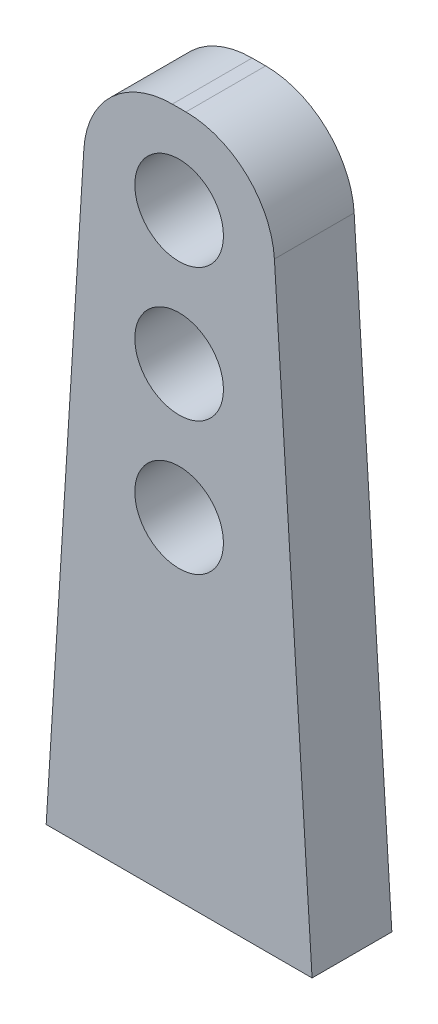
ISO-10303-21;
HEADER;
FILE_DESCRIPTION(('STEP AP214'),'2;1');
FILE_NAME('part.step','',(''),(''),'','','');
FILE_SCHEMA(('AUTOMOTIVE_DESIGN { 1 0 10303 214 1 1 1 1 }'));
ENDSEC;
DATA;
#1=APPLICATION_CONTEXT('core data for automotive mechanical design processes');
#2=APPLICATION_PROTOCOL_DEFINITION('international standard','automotive_design',2000,#1);
#3=PRODUCT_CONTEXT('',#1,'mechanical');
#4=PRODUCT('Part','Part','',(#3));
#5=PRODUCT_RELATED_PRODUCT_CATEGORY('part','',(#4));
#6=PRODUCT_DEFINITION_FORMATION('','',#4);
#7=PRODUCT_DEFINITION_CONTEXT('part definition',#1,'design');
#8=PRODUCT_DEFINITION('design','',#6,#7);
#9=PRODUCT_DEFINITION_SHAPE('','',#8);
#10=(LENGTH_UNIT() NAMED_UNIT(*) SI_UNIT(.MILLI.,.METRE.));
#11=(NAMED_UNIT(*) PLANE_ANGLE_UNIT() SI_UNIT($,.RADIAN.));
#12=(NAMED_UNIT(*) SI_UNIT($,.STERADIAN.) SOLID_ANGLE_UNIT());
#13=UNCERTAINTY_MEASURE_WITH_UNIT(LENGTH_MEASURE(1.E-05),#10,'distance_accuracy_value','');
#14=(GEOMETRIC_REPRESENTATION_CONTEXT(3) GLOBAL_UNCERTAINTY_ASSIGNED_CONTEXT((#13)) GLOBAL_UNIT_ASSIGNED_CONTEXT((#10,
#11,#12)) REPRESENTATION_CONTEXT('',''));
#15=CARTESIAN_POINT('',(0.,0.,0.));
#16=DIRECTION('',(0.,0.,1.));
#17=DIRECTION('',(1.,0.,0.));
#18=AXIS2_PLACEMENT_3D('',#15,#16,#17);
#19=CARTESIAN_POINT('',(1.5698711254477,6.70179743035683,0.899922));
#20=DIRECTION('',(0.,0.,1.));
#21=DIRECTION('',(1.,0.,0.));
#22=AXIS2_PLACEMENT_3D('',#19,#20,#21);
#23=PLANE('',#22);
#24=CARTESIAN_POINT('',(1.4929012576455,5.20179743035684,0.899922));
#25=DIRECTION('',(0.,0.,1.));
#26=DIRECTION('',(1.,0.,0.));
#27=AXIS2_PLACEMENT_3D('',#24,#25,#26);
#28=CIRCLE('',#27,0.499999999999996);
#29=CARTESIAN_POINT('',(1.9929012576455,5.20179743035684,0.899922));
#30=VERTEX_POINT('',#29);
#31=EDGE_CURVE('E253',#30,#30,#28,.T.);
#32=ORIENTED_EDGE('',*,*,#31,.F.);
#33=EDGE_LOOP('',(#32));
#34=FACE_BOUND('',#33,.T.);
#35=DIRECTION('',(1.,0.,0.));
#36=VECTOR('',#35,1.);
#37=CARTESIAN_POINT('',(-0.00709874235449632,-0.0482025696431649,0.899922));
#38=LINE('',#37,#36);
#39=CARTESIAN_POINT('',(-0.00709874235449632,-0.0482025696431649,0.899922));
#40=VERTEX_POINT('',#39);
#41=CARTESIAN_POINT('',(2.9929012576455,-0.0482025696431649,0.899922));
#42=VERTEX_POINT('',#41);
#43=EDGE_CURVE('E198',#40,#42,#38,.T.);
#44=ORIENTED_EDGE('',*,*,#43,.T.);
#45=DIRECTION('',(-0.0622621060775064,0.998059832949304,0.));
#46=VECTOR('',#45,1.);
#47=CARTESIAN_POINT('',(2.9929012576455,-0.0482025696431649,0.899922));
#48=LINE('',#47,#46);
#49=CARTESIAN_POINT('',(2.567930958397,6.76405953643435,0.899922));
#50=VERTEX_POINT('',#49);
#51=EDGE_CURVE('E156',#42,#50,#48,.T.);
#52=ORIENTED_EDGE('',*,*,#51,.T.);
#53=CARTESIAN_POINT('',(1.5698711254477,6.70179743035683,0.899922));
#54=DIRECTION('',(0.,0.,1.));
#55=DIRECTION('',(1.,0.,0.));
#56=AXIS2_PLACEMENT_3D('',#53,#54,#55);
#57=CIRCLE('',#56,1.);
#58=CARTESIAN_POINT('',(1.5698711254477,7.70179743035683,0.899922));
#59=VERTEX_POINT('',#58);
#60=EDGE_CURVE('E169',#50,#59,#57,.T.);
#61=ORIENTED_EDGE('',*,*,#60,.T.);
#62=DIRECTION('',(-1.,0.,0.));
#63=VECTOR('',#62,1.);
#64=CARTESIAN_POINT('',(1.5698711254477,7.70179743035683,0.899922));
#65=LINE('',#64,#63);
#66=CARTESIAN_POINT('',(1.41624750950107,7.70179743035683,0.899922));
#67=VERTEX_POINT('',#66);
#68=EDGE_CURVE('E163',#59,#67,#65,.T.);
#69=ORIENTED_EDGE('',*,*,#68,.T.);
#70=CARTESIAN_POINT('',(1.41624750950107,6.70179743035683,0.899922));
#71=DIRECTION('',(0.,0.,1.));
#72=DIRECTION('',(1.,0.,0.));
#73=AXIS2_PLACEMENT_3D('',#70,#71,#72);
#74=CIRCLE('',#73,1.);
#75=CARTESIAN_POINT('',(0.418190555641917,6.76410567101073,0.899922));
#76=VERTEX_POINT('',#75);
#77=EDGE_CURVE('E167',#67,#76,#74,.T.);
#78=ORIENTED_EDGE('',*,*,#77,.T.);
#79=DIRECTION('',(-0.0623082406538983,-0.998056953859155,0.));
#80=VECTOR('',#79,1.);
#81=CARTESIAN_POINT('',(0.418190555641916,6.76410567101073,0.899922));
#82=LINE('',#81,#80);
#83=EDGE_CURVE('E119',#76,#40,#82,.T.);
#84=ORIENTED_EDGE('',*,*,#83,.T.);
#85=EDGE_LOOP('',(#44,#52,#61,#69,#78,#84));
#86=FACE_BOUND('',#85,.T.);
#87=CARTESIAN_POINT('',(1.4929012576455,3.70179743035684,0.899922));
#88=DIRECTION('',(0.,0.,1.));
#89=DIRECTION('',(1.,0.,0.));
#90=AXIS2_PLACEMENT_3D('',#87,#88,#89);
#91=CIRCLE('',#90,0.499999999999995);
#92=CARTESIAN_POINT('',(1.9929012576455,3.70179743035684,0.899922));
#93=VERTEX_POINT('',#92);
#94=EDGE_CURVE('E191',#93,#93,#91,.T.);
#95=ORIENTED_EDGE('',*,*,#94,.F.);
#96=EDGE_LOOP('',(#95));
#97=FACE_BOUND('',#96,.T.);
#98=CARTESIAN_POINT('',(1.4929012576455,6.70179743035683,0.899922));
#99=DIRECTION('',(0.,0.,1.));
#100=DIRECTION('',(1.,0.,0.));
#101=AXIS2_PLACEMENT_3D('',#98,#99,#100);
#102=CIRCLE('',#101,0.499999999999996);
#103=CARTESIAN_POINT('',(1.9929012576455,6.70179743035683,0.899922));
#104=VERTEX_POINT('',#103);
#105=EDGE_CURVE('E244',#104,#104,#102,.T.);
#106=ORIENTED_EDGE('',*,*,#105,.F.);
#107=EDGE_LOOP('',(#106));
#108=FACE_BOUND('',#107,.T.);
#109=ADVANCED_FACE('F102',(#34,#86,#97,#108),#23,.T.);
#110=CARTESIAN_POINT('',(1.5698711254477,6.70179743035683,0.));
#111=DIRECTION('',(0.,0.,1.));
#112=DIRECTION('',(1.,0.,0.));
#113=AXIS2_PLACEMENT_3D('',#110,#111,#112);
#114=PLANE('',#113);
#115=DIRECTION('',(1.,0.,0.));
#116=VECTOR('',#115,1.);
#117=CARTESIAN_POINT('',(-0.00709874235449632,-0.0482025696431649,0.));
#118=LINE('',#117,#116);
#119=CARTESIAN_POINT('',(-0.00709874235449632,-0.0482025696431649,0.));
#120=VERTEX_POINT('',#119);
#121=CARTESIAN_POINT('',(2.9929012576455,-0.0482025696431649,0.));
#122=VERTEX_POINT('',#121);
#123=EDGE_CURVE('E187',#120,#122,#118,.T.);
#124=ORIENTED_EDGE('',*,*,#123,.F.);
#125=DIRECTION('',(-0.0623082406538983,-0.998056953859155,0.));
#126=VECTOR('',#125,1.);
#127=CARTESIAN_POINT('',(0.418190555641916,6.76410567101073,0.));
#128=LINE('',#127,#126);
#129=CARTESIAN_POINT('',(0.418190555641917,6.76410567101073,0.));
#130=VERTEX_POINT('',#129);
#131=EDGE_CURVE('E148',#130,#120,#128,.T.);
#132=ORIENTED_EDGE('',*,*,#131,.F.);
#133=CARTESIAN_POINT('',(1.41624750950107,6.70179743035683,0.));
#134=DIRECTION('',(0.,0.,1.));
#135=DIRECTION('',(1.,0.,0.));
#136=AXIS2_PLACEMENT_3D('',#133,#134,#135);
#137=CIRCLE('',#136,1.);
#138=CARTESIAN_POINT('',(1.41624750950107,7.70179743035683,0.));
#139=VERTEX_POINT('',#138);
#140=EDGE_CURVE('E142',#139,#130,#137,.T.);
#141=ORIENTED_EDGE('',*,*,#140,.F.);
#142=DIRECTION('',(-1.,0.,0.));
#143=VECTOR('',#142,1.);
#144=CARTESIAN_POINT('',(1.5698711254477,7.70179743035683,0.));
#145=LINE('',#144,#143);
#146=CARTESIAN_POINT('',(1.5698711254477,7.70179743035683,0.));
#147=VERTEX_POINT('',#146);
#148=EDGE_CURVE('E177',#147,#139,#145,.T.);
#149=ORIENTED_EDGE('',*,*,#148,.F.);
#150=CARTESIAN_POINT('',(1.5698711254477,6.70179743035683,0.));
#151=DIRECTION('',(0.,0.,1.));
#152=DIRECTION('',(1.,0.,0.));
#153=AXIS2_PLACEMENT_3D('',#150,#151,#152);
#154=CIRCLE('',#153,1.);
#155=CARTESIAN_POINT('',(2.567930958397,6.76405953643435,0.));
#156=VERTEX_POINT('',#155);
#157=EDGE_CURVE('E193',#156,#147,#154,.T.);
#158=ORIENTED_EDGE('',*,*,#157,.F.);
#159=DIRECTION('',(-0.0622621060775064,0.998059832949304,0.));
#160=VECTOR('',#159,1.);
#161=CARTESIAN_POINT('',(2.9929012576455,-0.0482025696431649,0.));
#162=LINE('',#161,#160);
#163=EDGE_CURVE('E190',#122,#156,#162,.T.);
#164=ORIENTED_EDGE('',*,*,#163,.F.);
#165=EDGE_LOOP('',(#124,#132,#141,#149,#158,#164));
#166=FACE_BOUND('',#165,.T.);
#167=CARTESIAN_POINT('',(1.4929012576455,3.70179743035684,0.));
#168=DIRECTION('',(0.,0.,1.));
#169=DIRECTION('',(1.,0.,0.));
#170=AXIS2_PLACEMENT_3D('',#167,#168,#169);
#171=CIRCLE('',#170,0.499999999999995);
#172=CARTESIAN_POINT('',(1.9929012576455,3.70179743035684,0.));
#173=VERTEX_POINT('',#172);
#174=EDGE_CURVE('E256',#173,#173,#171,.T.);
#175=ORIENTED_EDGE('',*,*,#174,.T.);
#176=EDGE_LOOP('',(#175));
#177=FACE_BOUND('',#176,.T.);
#178=CARTESIAN_POINT('',(1.4929012576455,5.20179743035684,0.));
#179=DIRECTION('',(0.,0.,1.));
#180=DIRECTION('',(1.,0.,0.));
#181=AXIS2_PLACEMENT_3D('',#178,#179,#180);
#182=CIRCLE('',#181,0.499999999999996);
#183=CARTESIAN_POINT('',(1.9929012576455,5.20179743035684,0.));
#184=VERTEX_POINT('',#183);
#185=EDGE_CURVE('E250',#184,#184,#182,.T.);
#186=ORIENTED_EDGE('',*,*,#185,.T.);
#187=EDGE_LOOP('',(#186));
#188=FACE_BOUND('',#187,.T.);
#189=CARTESIAN_POINT('',(1.4929012576455,6.70179743035683,0.));
#190=DIRECTION('',(0.,0.,1.));
#191=DIRECTION('',(1.,0.,0.));
#192=AXIS2_PLACEMENT_3D('',#189,#190,#191);
#193=CIRCLE('',#192,0.499999999999996);
#194=CARTESIAN_POINT('',(1.9929012576455,6.70179743035683,0.));
#195=VERTEX_POINT('',#194);
#196=EDGE_CURVE('E247',#195,#195,#193,.T.);
#197=ORIENTED_EDGE('',*,*,#196,.T.);
#198=EDGE_LOOP('',(#197));
#199=FACE_BOUND('',#198,.T.);
#200=ADVANCED_FACE('F207',(#166,#177,#188,#199),#114,.F.);
#201=CARTESIAN_POINT('',(-0.00709874235449632,-0.0482025696431649,0.899922));
#202=DIRECTION('',(0.,1.,0.));
#203=DIRECTION('',(0.,0.,1.));
#204=AXIS2_PLACEMENT_3D('',#201,#202,#203);
#205=PLANE('',#204);
#206=ORIENTED_EDGE('',*,*,#123,.T.);
#207=DIRECTION('',(0.,0.,-1.));
#208=VECTOR('',#207,1.);
#209=CARTESIAN_POINT('',(2.9929012576455,-0.0482025696431649,0.899922));
#210=LINE('',#209,#208);
#211=EDGE_CURVE('E12',#42,#122,#210,.T.);
#212=ORIENTED_EDGE('',*,*,#211,.F.);
#213=ORIENTED_EDGE('',*,*,#43,.F.);
#214=DIRECTION('',(0.,0.,-1.));
#215=VECTOR('',#214,1.);
#216=CARTESIAN_POINT('',(-0.00709874235449632,-0.0482025696431649,0.899922));
#217=LINE('',#216,#215);
#218=EDGE_CURVE('E183',#40,#120,#217,.T.);
#219=ORIENTED_EDGE('',*,*,#218,.T.);
#220=EDGE_LOOP('',(#206,#212,#213,#219));
#221=FACE_BOUND('',#220,.T.);
#222=ADVANCED_FACE('F104',(#221),#205,.F.);
#223=CARTESIAN_POINT('',(2.9929012576455,-0.0482025696431649,0.899922));
#224=DIRECTION('',(-0.998059832949304,-0.0622621060775064,0.));
#225=DIRECTION('',(0.0622621060775064,-0.998059832949304,0.));
#226=AXIS2_PLACEMENT_3D('',#223,#224,#225);
#227=PLANE('',#226);
#228=ORIENTED_EDGE('',*,*,#163,.T.);
#229=DIRECTION('',(0.,0.,-1.));
#230=VECTOR('',#229,1.);
#231=CARTESIAN_POINT('',(2.567930958397,6.76405953643435,0.899922));
#232=LINE('',#231,#230);
#233=EDGE_CURVE('E111',#50,#156,#232,.T.);
#234=ORIENTED_EDGE('',*,*,#233,.F.);
#235=ORIENTED_EDGE('',*,*,#51,.F.);
#236=ORIENTED_EDGE('',*,*,#211,.T.);
#237=EDGE_LOOP('',(#228,#234,#235,#236));
#238=FACE_BOUND('',#237,.T.);
#239=ADVANCED_FACE('F310',(#238),#227,.F.);
#240=CARTESIAN_POINT('',(1.5698711254477,6.70179743035683,0.899922));
#241=DIRECTION('',(0.,0.,-1.));
#242=DIRECTION('',(-1.,0.,0.));
#243=AXIS2_PLACEMENT_3D('',#240,#241,#242);
#244=CYLINDRICAL_SURFACE('',#243,1.);
#245=ORIENTED_EDGE('',*,*,#157,.T.);
#246=DIRECTION('',(0.,0.,-1.));
#247=VECTOR('',#246,1.);
#248=CARTESIAN_POINT('',(1.5698711254477,7.70179743035683,0.899922));
#249=LINE('',#248,#247);
#250=EDGE_CURVE('E178',#59,#147,#249,.T.);
#251=ORIENTED_EDGE('',*,*,#250,.F.);
#252=ORIENTED_EDGE('',*,*,#60,.F.);
#253=ORIENTED_EDGE('',*,*,#233,.T.);
#254=EDGE_LOOP('',(#245,#251,#252,#253));
#255=FACE_BOUND('',#254,.T.);
#256=ADVANCED_FACE('F204',(#255),#244,.T.);
#257=CARTESIAN_POINT('',(1.5698711254477,7.70179743035683,0.899922));
#258=DIRECTION('',(0.,-1.,0.));
#259=DIRECTION('',(0.,0.,-1.));
#260=AXIS2_PLACEMENT_3D('',#257,#258,#259);
#261=PLANE('',#260);
#262=ORIENTED_EDGE('',*,*,#148,.T.);
#263=DIRECTION('',(0.,0.,-1.));
#264=VECTOR('',#263,1.);
#265=CARTESIAN_POINT('',(1.41624750950107,7.70179743035683,0.899922));
#266=LINE('',#265,#264);
#267=EDGE_CURVE('E174',#67,#139,#266,.T.);
#268=ORIENTED_EDGE('',*,*,#267,.F.);
#269=ORIENTED_EDGE('',*,*,#68,.F.);
#270=ORIENTED_EDGE('',*,*,#250,.T.);
#271=EDGE_LOOP('',(#262,#268,#269,#270));
#272=FACE_BOUND('',#271,.T.);
#273=ADVANCED_FACE('F175',(#272),#261,.F.);
#274=CARTESIAN_POINT('',(1.41624750950107,6.70179743035683,0.899922));
#275=DIRECTION('',(0.,0.,-1.));
#276=DIRECTION('',(-1.,0.,0.));
#277=AXIS2_PLACEMENT_3D('',#274,#275,#276);
#278=CYLINDRICAL_SURFACE('',#277,1.);
#279=ORIENTED_EDGE('',*,*,#140,.T.);
#280=DIRECTION('',(0.,0.,-1.));
#281=VECTOR('',#280,1.);
#282=CARTESIAN_POINT('',(0.418190555641917,6.76410567101073,0.899922));
#283=LINE('',#282,#281);
#284=EDGE_CURVE('E179',#76,#130,#283,.T.);
#285=ORIENTED_EDGE('',*,*,#284,.F.);
#286=ORIENTED_EDGE('',*,*,#77,.F.);
#287=ORIENTED_EDGE('',*,*,#267,.T.);
#288=EDGE_LOOP('',(#279,#285,#286,#287));
#289=FACE_BOUND('',#288,.T.);
#290=ADVANCED_FACE('F181',(#289),#278,.T.);
#291=CARTESIAN_POINT('',(0.418190555641916,6.76410567101073,0.899922));
#292=DIRECTION('',(0.998056953859155,-0.0623082406538983,0.));
#293=DIRECTION('',(0.0623082406538983,0.998056953859155,0.));
#294=AXIS2_PLACEMENT_3D('',#291,#292,#293);
#295=PLANE('',#294);
#296=ORIENTED_EDGE('',*,*,#131,.T.);
#297=ORIENTED_EDGE('',*,*,#218,.F.);
#298=ORIENTED_EDGE('',*,*,#83,.F.);
#299=ORIENTED_EDGE('',*,*,#284,.T.);
#300=EDGE_LOOP('',(#296,#297,#298,#299));
#301=FACE_BOUND('',#300,.T.);
#302=ADVANCED_FACE('F212',(#301),#295,.F.);
#303=CARTESIAN_POINT('',(1.4929012576455,3.70179743035684,0.899922));
#304=DIRECTION('',(0.,0.,-1.));
#305=DIRECTION('',(-1.,0.,0.));
#306=AXIS2_PLACEMENT_3D('',#303,#304,#305);
#307=CYLINDRICAL_SURFACE('',#306,0.499999999999995);
#308=ORIENTED_EDGE('',*,*,#94,.T.);
#309=EDGE_LOOP('',(#308));
#310=FACE_BOUND('',#309,.T.);
#311=ORIENTED_EDGE('',*,*,#174,.F.);
#312=EDGE_LOOP('',(#311));
#313=FACE_BOUND('',#312,.T.);
#314=ADVANCED_FACE('F214',(#310,#313),#307,.F.);
#315=CARTESIAN_POINT('',(1.4929012576455,5.20179743035684,0.899922));
#316=DIRECTION('',(0.,0.,-1.));
#317=DIRECTION('',(-1.,0.,0.));
#318=AXIS2_PLACEMENT_3D('',#315,#316,#317);
#319=CYLINDRICAL_SURFACE('',#318,0.499999999999996);
#320=ORIENTED_EDGE('',*,*,#31,.T.);
#321=EDGE_LOOP('',(#320));
#322=FACE_BOUND('',#321,.T.);
#323=ORIENTED_EDGE('',*,*,#185,.F.);
#324=EDGE_LOOP('',(#323));
#325=FACE_BOUND('',#324,.T.);
#326=ADVANCED_FACE('F220',(#322,#325),#319,.F.);
#327=CARTESIAN_POINT('',(1.4929012576455,6.70179743035683,0.899922));
#328=DIRECTION('',(0.,0.,-1.));
#329=DIRECTION('',(-1.,0.,0.));
#330=AXIS2_PLACEMENT_3D('',#327,#328,#329);
#331=CYLINDRICAL_SURFACE('',#330,0.499999999999996);
#332=ORIENTED_EDGE('',*,*,#105,.T.);
#333=EDGE_LOOP('',(#332));
#334=FACE_BOUND('',#333,.T.);
#335=ORIENTED_EDGE('',*,*,#196,.F.);
#336=EDGE_LOOP('',(#335));
#337=FACE_BOUND('',#336,.T.);
#338=ADVANCED_FACE('F235',(#334,#337),#331,.F.);
#339=CLOSED_SHELL('',(#109,#200,#222,#239,#256,#273,#290,#302,#314,#326,#338));
#340=MANIFOLD_SOLID_BREP('B2',#339);
#341=ADVANCED_BREP_SHAPE_REPRESENTATION('',(#18,#340),#14);
#342=SHAPE_DEFINITION_REPRESENTATION(#9,#341);
ENDSEC;
END-ISO-10303-21;
